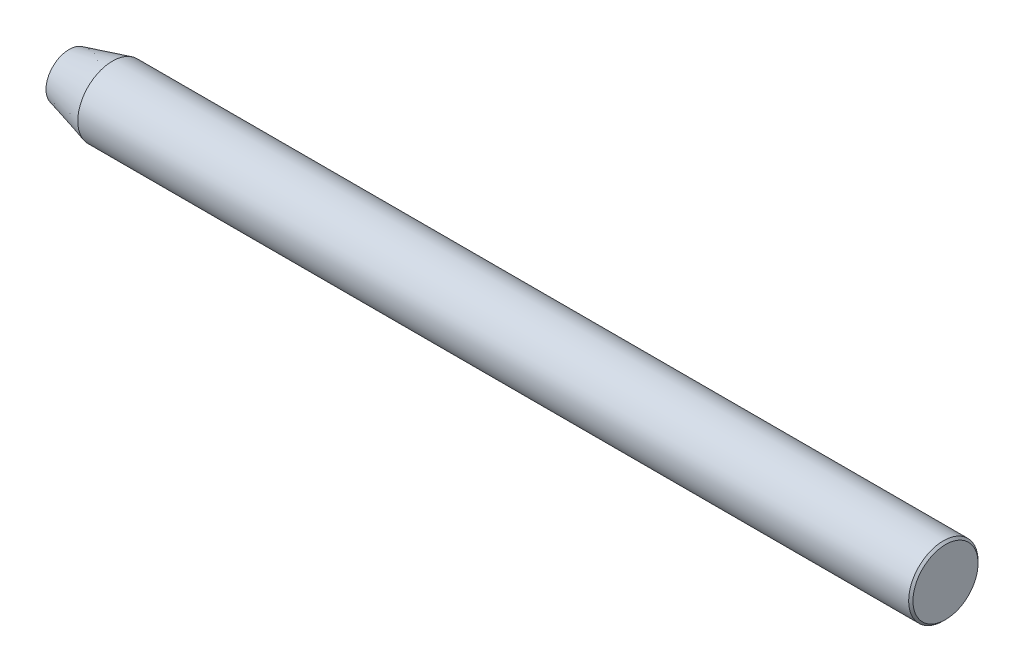
ISO-10303-21;
HEADER;
FILE_DESCRIPTION(('STEP AP214'),'2;1');
FILE_NAME('part.step','',(''),(''),'','','');
FILE_SCHEMA(('AUTOMOTIVE_DESIGN { 1 0 10303 214 1 1 1 1 }'));
ENDSEC;
DATA;
#1=APPLICATION_CONTEXT('core data for automotive mechanical design processes');
#2=APPLICATION_PROTOCOL_DEFINITION('international standard','automotive_design',2000,#1);
#3=PRODUCT_CONTEXT('',#1,'mechanical');
#4=PRODUCT('Part','Part','',(#3));
#5=PRODUCT_RELATED_PRODUCT_CATEGORY('part','',(#4));
#6=PRODUCT_DEFINITION_FORMATION('','',#4);
#7=PRODUCT_DEFINITION_CONTEXT('part definition',#1,'design');
#8=PRODUCT_DEFINITION('design','',#6,#7);
#9=PRODUCT_DEFINITION_SHAPE('','',#8);
#10=(LENGTH_UNIT() NAMED_UNIT(*) SI_UNIT(.MILLI.,.METRE.));
#11=(NAMED_UNIT(*) PLANE_ANGLE_UNIT() SI_UNIT($,.RADIAN.));
#12=(NAMED_UNIT(*) SI_UNIT($,.STERADIAN.) SOLID_ANGLE_UNIT());
#13=UNCERTAINTY_MEASURE_WITH_UNIT(LENGTH_MEASURE(1.E-05),#10,'distance_accuracy_value','');
#14=(GEOMETRIC_REPRESENTATION_CONTEXT(3) GLOBAL_UNCERTAINTY_ASSIGNED_CONTEXT((#13)) GLOBAL_UNIT_ASSIGNED_CONTEXT((#10,
#11,#12)) REPRESENTATION_CONTEXT('',''));
#15=CARTESIAN_POINT('',(0.,0.,0.));
#16=DIRECTION('',(0.,0.,1.));
#17=DIRECTION('',(1.,0.,0.));
#18=AXIS2_PLACEMENT_3D('',#15,#16,#17);
#19=CARTESIAN_POINT('',(9.99999999999982,0.,0.));
#20=DIRECTION('',(1.,0.,0.));
#21=DIRECTION('',(0.,0.,1.));
#22=AXIS2_PLACEMENT_3D('',#19,#20,#21);
#23=CONICAL_SURFACE('',#22,8.,0.261799387799152);
#24=CARTESIAN_POINT('',(0.,0.,0.));
#25=DIRECTION('',(-1.,0.,0.));
#26=DIRECTION('',(0.,0.,1.));
#27=AXIS2_PLACEMENT_3D('',#24,#25,#26);
#28=CIRCLE('',#27,5.3205080756888);
#29=CARTESIAN_POINT('',(0.,0.,5.3205080756888));
#30=VERTEX_POINT('',#29);
#31=EDGE_CURVE('E10',#30,#30,#28,.T.);
#32=ORIENTED_EDGE('',*,*,#31,.F.);
#33=EDGE_LOOP('',(#32));
#34=FACE_BOUND('',#33,.T.);
#35=CARTESIAN_POINT('',(9.99999999999982,0.,0.));
#36=DIRECTION('',(-1.,0.,0.));
#37=DIRECTION('',(0.,0.,1.));
#38=AXIS2_PLACEMENT_3D('',#35,#36,#37);
#39=CIRCLE('',#38,8.);
#40=CARTESIAN_POINT('',(9.99999999999982,0.,8.));
#41=VERTEX_POINT('',#40);
#42=EDGE_CURVE('E53',#41,#41,#39,.T.);
#43=ORIENTED_EDGE('',*,*,#42,.T.);
#44=EDGE_LOOP('',(#43));
#45=FACE_BOUND('',#44,.T.);
#46=ADVANCED_FACE('F39',(#34,#45),#23,.T.);
#47=CARTESIAN_POINT('',(0.,5.3205080756888,0.));
#48=DIRECTION('',(-1.,0.,0.));
#49=DIRECTION('',(0.,0.,-1.));
#50=AXIS2_PLACEMENT_3D('',#47,#48,#49);
#51=PLANE('',#50);
#52=ORIENTED_EDGE('',*,*,#31,.T.);
#53=EDGE_LOOP('',(#52));
#54=FACE_BOUND('',#53,.T.);
#55=ADVANCED_FACE('F73',(#54),#51,.T.);
#56=CARTESIAN_POINT('',(202.,0.,0.));
#57=DIRECTION('',(1.,0.,0.));
#58=DIRECTION('',(0.,0.,1.));
#59=AXIS2_PLACEMENT_3D('',#56,#57,#58);
#60=PLANE('',#59);
#61=CARTESIAN_POINT('',(202.,0.,0.));
#62=DIRECTION('',(-1.,0.,0.));
#63=DIRECTION('',(0.,0.,1.));
#64=AXIS2_PLACEMENT_3D('',#61,#62,#63);
#65=CIRCLE('',#64,7.5);
#66=CARTESIAN_POINT('',(202.,0.,7.5));
#67=VERTEX_POINT('',#66);
#68=EDGE_CURVE('E45',#67,#67,#65,.T.);
#69=ORIENTED_EDGE('',*,*,#68,.F.);
#70=EDGE_LOOP('',(#69));
#71=FACE_BOUND('',#70,.T.);
#72=ADVANCED_FACE('F68',(#71),#60,.T.);
#73=CARTESIAN_POINT('',(202.,0.,0.));
#74=DIRECTION('',(-1.,0.,0.));
#75=DIRECTION('',(0.,0.,-1.));
#76=AXIS2_PLACEMENT_3D('',#73,#74,#75);
#77=CONICAL_SURFACE('',#76,7.5,0.785398163397445);
#78=CARTESIAN_POINT('',(201.5,0.,0.));
#79=DIRECTION('',(-1.,0.,0.));
#80=DIRECTION('',(0.,0.,1.));
#81=AXIS2_PLACEMENT_3D('',#78,#79,#80);
#82=CIRCLE('',#81,8.);
#83=CARTESIAN_POINT('',(201.5,0.,8.));
#84=VERTEX_POINT('',#83);
#85=EDGE_CURVE('E49',#84,#84,#82,.T.);
#86=ORIENTED_EDGE('',*,*,#85,.F.);
#87=EDGE_LOOP('',(#86));
#88=FACE_BOUND('',#87,.T.);
#89=ORIENTED_EDGE('',*,*,#68,.T.);
#90=EDGE_LOOP('',(#89));
#91=FACE_BOUND('',#90,.T.);
#92=ADVANCED_FACE('F63',(#88,#91),#77,.T.);
#93=CARTESIAN_POINT('',(-0.0049999999999998,0.,0.));
#94=DIRECTION('',(1.,0.,0.));
#95=DIRECTION('',(0.,0.,1.));
#96=AXIS2_PLACEMENT_3D('',#93,#94,#95);
#97=CYLINDRICAL_SURFACE('',#96,8.);
#98=ORIENTED_EDGE('',*,*,#42,.F.);
#99=EDGE_LOOP('',(#98));
#100=FACE_BOUND('',#99,.T.);
#101=ORIENTED_EDGE('',*,*,#85,.T.);
#102=EDGE_LOOP('',(#101));
#103=FACE_BOUND('',#102,.T.);
#104=ADVANCED_FACE('F60',(#100,#103),#97,.T.);
#105=CLOSED_SHELL('',(#46,#55,#72,#92,#104));
#106=MANIFOLD_SOLID_BREP('B2',#105);
#107=ADVANCED_BREP_SHAPE_REPRESENTATION('',(#18,#106),#14);
#108=SHAPE_DEFINITION_REPRESENTATION(#9,#107);
ENDSEC;
END-ISO-10303-21;
